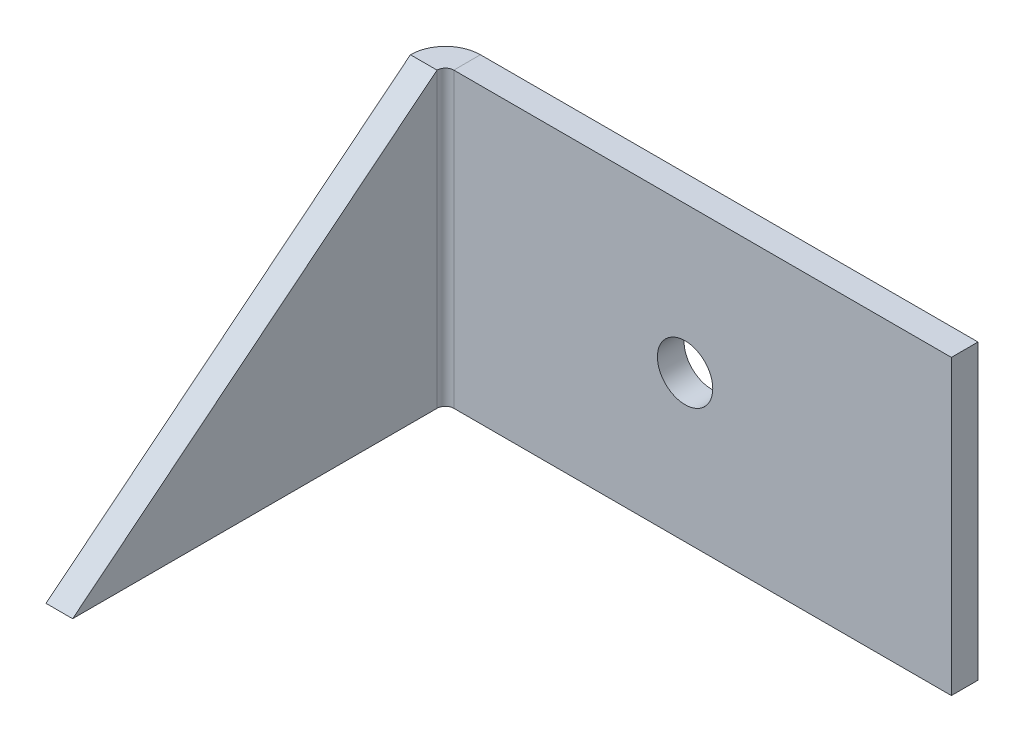
ISO-10303-21;
HEADER;
FILE_DESCRIPTION(('STEP AP214'),'2;1');
FILE_NAME('part.step','',(''),(''),'','','');
FILE_SCHEMA(('AUTOMOTIVE_DESIGN { 1 0 10303 214 1 1 1 1 }'));
ENDSEC;
DATA;
#1=APPLICATION_CONTEXT('core data for automotive mechanical design processes');
#2=APPLICATION_PROTOCOL_DEFINITION('international standard','automotive_design',2000,#1);
#3=PRODUCT_CONTEXT('',#1,'mechanical');
#4=PRODUCT('Part','Part','',(#3));
#5=PRODUCT_RELATED_PRODUCT_CATEGORY('part','',(#4));
#6=PRODUCT_DEFINITION_FORMATION('','',#4);
#7=PRODUCT_DEFINITION_CONTEXT('part definition',#1,'design');
#8=PRODUCT_DEFINITION('design','',#6,#7);
#9=PRODUCT_DEFINITION_SHAPE('','',#8);
#10=(LENGTH_UNIT() NAMED_UNIT(*) SI_UNIT(.MILLI.,.METRE.));
#11=(NAMED_UNIT(*) PLANE_ANGLE_UNIT() SI_UNIT($,.RADIAN.));
#12=(NAMED_UNIT(*) SI_UNIT($,.STERADIAN.) SOLID_ANGLE_UNIT());
#13=UNCERTAINTY_MEASURE_WITH_UNIT(LENGTH_MEASURE(1.E-05),#10,'distance_accuracy_value','');
#14=(GEOMETRIC_REPRESENTATION_CONTEXT(3) GLOBAL_UNCERTAINTY_ASSIGNED_CONTEXT((#13)) GLOBAL_UNIT_ASSIGNED_CONTEXT((#10,
#11,#12)) REPRESENTATION_CONTEXT('',''));
#15=CARTESIAN_POINT('',(0.,0.,0.));
#16=DIRECTION('',(0.,0.,1.));
#17=DIRECTION('',(1.,0.,0.));
#18=AXIS2_PLACEMENT_3D('',#15,#16,#17);
#19=CARTESIAN_POINT('',(-28.575,17.4625,3.175));
#20=DIRECTION('',(0.,-1.,0.));
#21=DIRECTION('',(0.,0.,-1.));
#22=AXIS2_PLACEMENT_3D('',#19,#20,#21);
#23=PLANE('',#22);
#24=DIRECTION('',(0.,0.,-1.));
#25=VECTOR('',#24,1.);
#26=CARTESIAN_POINT('',(-27.575,17.4625,3.175));
#27=LINE('',#26,#25);
#28=CARTESIAN_POINT('',(-27.575,17.4625,3.175));
#29=VERTEX_POINT('',#28);
#30=CARTESIAN_POINT('',(-27.575,17.4625,0.));
#31=VERTEX_POINT('',#30);
#32=EDGE_CURVE('E62',#29,#31,#27,.T.);
#33=ORIENTED_EDGE('',*,*,#32,.F.);
#34=DIRECTION('',(-1.,0.,0.));
#35=VECTOR('',#34,1.);
#36=CARTESIAN_POINT('',(-28.575,17.4625,3.175));
#37=LINE('',#36,#35);
#38=CARTESIAN_POINT('',(31.75,17.4625,3.175));
#39=VERTEX_POINT('',#38);
#40=EDGE_CURVE('E47',#39,#29,#37,.T.);
#41=ORIENTED_EDGE('',*,*,#40,.F.);
#42=DIRECTION('',(0.,0.,1.));
#43=VECTOR('',#42,1.);
#44=CARTESIAN_POINT('',(31.75,17.4625,0.));
#45=LINE('',#44,#43);
#46=CARTESIAN_POINT('',(31.75,17.4625,0.));
#47=VERTEX_POINT('',#46);
#48=EDGE_CURVE('E114',#47,#39,#45,.T.);
#49=ORIENTED_EDGE('',*,*,#48,.F.);
#50=DIRECTION('',(-1.,0.,0.));
#51=VECTOR('',#50,1.);
#52=CARTESIAN_POINT('',(-28.575,17.4625,0.));
#53=LINE('',#52,#51);
#54=EDGE_CURVE('E107',#47,#31,#53,.T.);
#55=ORIENTED_EDGE('',*,*,#54,.T.);
#56=EDGE_LOOP('',(#33,#41,#49,#55));
#57=FACE_BOUND('',#56,.T.);
#58=ADVANCED_FACE('F39',(#57),#23,.F.);
#59=CARTESIAN_POINT('',(-28.575,-17.4625,3.175));
#60=DIRECTION('',(0.,1.,0.));
#61=DIRECTION('',(0.,0.,1.));
#62=AXIS2_PLACEMENT_3D('',#59,#60,#61);
#63=PLANE('',#62);
#64=DIRECTION('',(0.,0.,-1.));
#65=VECTOR('',#64,1.);
#66=CARTESIAN_POINT('',(-27.575,-17.4625,3.175));
#67=LINE('',#66,#65);
#68=CARTESIAN_POINT('',(-27.575,-17.4625,3.175));
#69=VERTEX_POINT('',#68);
#70=CARTESIAN_POINT('',(-27.575,-17.4625,0.));
#71=VERTEX_POINT('',#70);
#72=EDGE_CURVE('E104',#69,#71,#67,.T.);
#73=ORIENTED_EDGE('',*,*,#72,.T.);
#74=DIRECTION('',(1.,0.,0.));
#75=VECTOR('',#74,1.);
#76=CARTESIAN_POINT('',(-28.575,-17.4625,0.));
#77=LINE('',#76,#75);
#78=CARTESIAN_POINT('',(31.75,-17.4625,0.));
#79=VERTEX_POINT('',#78);
#80=EDGE_CURVE('E42',#71,#79,#77,.T.);
#81=ORIENTED_EDGE('',*,*,#80,.T.);
#82=DIRECTION('',(0.,0.,-1.));
#83=VECTOR('',#82,1.);
#84=CARTESIAN_POINT('',(31.75,-17.4625,3.175));
#85=LINE('',#84,#83);
#86=CARTESIAN_POINT('',(31.75,-17.4625,3.175));
#87=VERTEX_POINT('',#86);
#88=EDGE_CURVE('E102',#87,#79,#85,.T.);
#89=ORIENTED_EDGE('',*,*,#88,.F.);
#90=DIRECTION('',(1.,0.,0.));
#91=VECTOR('',#90,1.);
#92=CARTESIAN_POINT('',(-28.575,-17.4625,3.175));
#93=LINE('',#92,#91);
#94=EDGE_CURVE('E11',#69,#87,#93,.T.);
#95=ORIENTED_EDGE('',*,*,#94,.F.);
#96=EDGE_LOOP('',(#73,#81,#89,#95));
#97=FACE_BOUND('',#96,.T.);
#98=ADVANCED_FACE('F100',(#97),#63,.F.);
#99=CARTESIAN_POINT('',(0.,0.,3.175));
#100=DIRECTION('',(0.,0.,1.));
#101=DIRECTION('',(1.,0.,0.));
#102=AXIS2_PLACEMENT_3D('',#99,#100,#101);
#103=PLANE('',#102);
#104=CARTESIAN_POINT('',(0.,0.,3.175));
#105=DIRECTION('',(0.,0.,1.));
#106=DIRECTION('',(1.,0.,0.));
#107=AXIS2_PLACEMENT_3D('',#104,#105,#106);
#108=CIRCLE('',#107,3.29999999999999);
#109=CARTESIAN_POINT('',(3.29999999999999,0.,3.175));
#110=VERTEX_POINT('',#109);
#111=EDGE_CURVE('E162',#110,#110,#108,.T.);
#112=ORIENTED_EDGE('',*,*,#111,.F.);
#113=EDGE_LOOP('',(#112));
#114=FACE_BOUND('',#113,.T.);
#115=ORIENTED_EDGE('',*,*,#40,.T.);
#116=DIRECTION('',(0.,-1.,0.));
#117=VECTOR('',#116,1.);
#118=CARTESIAN_POINT('',(-27.575,-17.4625,3.175));
#119=LINE('',#118,#117);
#120=EDGE_CURVE('E54',#69,#29,#119,.F.);
#121=ORIENTED_EDGE('',*,*,#120,.F.);
#122=ORIENTED_EDGE('',*,*,#94,.T.);
#123=DIRECTION('',(0.,-1.,0.));
#124=VECTOR('',#123,1.);
#125=CARTESIAN_POINT('',(31.75,17.4625,3.175));
#126=LINE('',#125,#124);
#127=EDGE_CURVE('E119',#39,#87,#126,.T.);
#128=ORIENTED_EDGE('',*,*,#127,.F.);
#129=EDGE_LOOP('',(#115,#121,#122,#128));
#130=FACE_BOUND('',#129,.T.);
#131=ADVANCED_FACE('F211',(#114,#130),#103,.T.);
#132=CARTESIAN_POINT('',(0.,0.,0.));
#133=DIRECTION('',(0.,0.,1.));
#134=DIRECTION('',(1.,0.,0.));
#135=AXIS2_PLACEMENT_3D('',#132,#133,#134);
#136=PLANE('',#135);
#137=CARTESIAN_POINT('',(0.,0.,0.));
#138=DIRECTION('',(0.,0.,1.));
#139=DIRECTION('',(1.,0.,0.));
#140=AXIS2_PLACEMENT_3D('',#137,#138,#139);
#141=CIRCLE('',#140,3.3);
#142=CARTESIAN_POINT('',(3.3,0.,0.));
#143=VERTEX_POINT('',#142);
#144=EDGE_CURVE('E166',#143,#143,#141,.T.);
#145=ORIENTED_EDGE('',*,*,#144,.T.);
#146=EDGE_LOOP('',(#145));
#147=FACE_BOUND('',#146,.T.);
#148=DIRECTION('',(0.,-1.,0.));
#149=VECTOR('',#148,1.);
#150=CARTESIAN_POINT('',(-27.575,-17.4625,0.));
#151=LINE('',#150,#149);
#152=EDGE_CURVE('E147',#71,#31,#151,.F.);
#153=ORIENTED_EDGE('',*,*,#152,.T.);
#154=ORIENTED_EDGE('',*,*,#54,.F.);
#155=DIRECTION('',(0.,1.,0.));
#156=VECTOR('',#155,1.);
#157=CARTESIAN_POINT('',(31.75,-17.4625,0.));
#158=LINE('',#157,#156);
#159=EDGE_CURVE('E109',#79,#47,#158,.T.);
#160=ORIENTED_EDGE('',*,*,#159,.F.);
#161=ORIENTED_EDGE('',*,*,#80,.F.);
#162=EDGE_LOOP('',(#153,#154,#160,#161));
#163=FACE_BOUND('',#162,.T.);
#164=ADVANCED_FACE('F110',(#147,#163),#136,.F.);
#165=CARTESIAN_POINT('',(0.,0.,3.175));
#166=DIRECTION('',(0.,0.,1.));
#167=DIRECTION('',(1.,0.,0.));
#168=AXIS2_PLACEMENT_3D('',#165,#166,#167);
#169=CYLINDRICAL_SURFACE('',#168,3.29999999999999);
#170=ORIENTED_EDGE('',*,*,#144,.F.);
#171=EDGE_LOOP('',(#170));
#172=FACE_BOUND('',#171,.T.);
#173=ORIENTED_EDGE('',*,*,#111,.T.);
#174=EDGE_LOOP('',(#173));
#175=FACE_BOUND('',#174,.T.);
#176=ADVANCED_FACE('F204',(#172,#175),#169,.F.);
#177=CARTESIAN_POINT('',(-27.575,17.4625,4.17500000000001));
#178=DIRECTION('',(0.,1.,0.));
#179=DIRECTION('',(0.,0.,1.));
#180=AXIS2_PLACEMENT_3D('',#177,#178,#179);
#181=PLANE('',#180);
#182=DIRECTION('',(-1.,0.,0.));
#183=VECTOR('',#182,1.);
#184=CARTESIAN_POINT('',(-28.575,17.4625,4.175));
#185=LINE('',#184,#183);
#186=CARTESIAN_POINT('',(-28.5750000000001,17.4625,4.175));
#187=VERTEX_POINT('',#186);
#188=CARTESIAN_POINT('',(-31.75,17.4625,4.17499999999999));
#189=VERTEX_POINT('',#188);
#190=EDGE_CURVE('E128',#187,#189,#185,.T.);
#191=ORIENTED_EDGE('',*,*,#190,.F.);
#192=CARTESIAN_POINT('',(-27.575,17.4625,4.17500000000001));
#193=DIRECTION('',(0.,-1.,0.));
#194=DIRECTION('',(0.,0.,-1.));
#195=AXIS2_PLACEMENT_3D('',#192,#193,#194);
#196=CIRCLE('',#195,1.);
#197=EDGE_CURVE('E155',#29,#187,#196,.F.);
#198=ORIENTED_EDGE('',*,*,#197,.F.);
#199=ORIENTED_EDGE('',*,*,#32,.T.);
#200=CARTESIAN_POINT('',(-27.575,17.4625,4.17500000000001));
#201=DIRECTION('',(0.,-1.,0.));
#202=DIRECTION('',(0.,0.,-1.));
#203=AXIS2_PLACEMENT_3D('',#200,#201,#202);
#204=CIRCLE('',#203,4.175);
#205=EDGE_CURVE('E149',#31,#189,#204,.F.);
#206=ORIENTED_EDGE('',*,*,#205,.T.);
#207=EDGE_LOOP('',(#191,#198,#199,#206));
#208=FACE_BOUND('',#207,.T.);
#209=ADVANCED_FACE('F173',(#208),#181,.T.);
#210=CARTESIAN_POINT('',(-27.575,-17.4625,4.17500000000001));
#211=DIRECTION('',(0.,1.,0.));
#212=DIRECTION('',(0.,0.,1.));
#213=AXIS2_PLACEMENT_3D('',#210,#211,#212);
#214=PLANE('',#213);
#215=CARTESIAN_POINT('',(-27.575,-17.4625,4.17500000000001));
#216=DIRECTION('',(0.,-1.,0.));
#217=DIRECTION('',(0.,0.,-1.));
#218=AXIS2_PLACEMENT_3D('',#215,#216,#217);
#219=CIRCLE('',#218,1.);
#220=CARTESIAN_POINT('',(-28.575,-17.4625,4.175));
#221=VERTEX_POINT('',#220);
#222=EDGE_CURVE('E146',#221,#69,#219,.T.);
#223=ORIENTED_EDGE('',*,*,#222,.F.);
#224=DIRECTION('',(-1.,0.,0.));
#225=VECTOR('',#224,1.);
#226=CARTESIAN_POINT('',(-28.575,-17.4625,4.175));
#227=LINE('',#226,#225);
#228=CARTESIAN_POINT('',(-31.75,-17.4625,4.17499999999999));
#229=VERTEX_POINT('',#228);
#230=EDGE_CURVE('E131',#221,#229,#227,.T.);
#231=ORIENTED_EDGE('',*,*,#230,.T.);
#232=CARTESIAN_POINT('',(-27.575,-17.4625,4.17500000000001));
#233=DIRECTION('',(0.,-1.,0.));
#234=DIRECTION('',(0.,0.,-1.));
#235=AXIS2_PLACEMENT_3D('',#232,#233,#234);
#236=CIRCLE('',#235,4.175);
#237=EDGE_CURVE('E150',#229,#71,#236,.T.);
#238=ORIENTED_EDGE('',*,*,#237,.T.);
#239=ORIENTED_EDGE('',*,*,#72,.F.);
#240=EDGE_LOOP('',(#223,#231,#238,#239));
#241=FACE_BOUND('',#240,.T.);
#242=ADVANCED_FACE('F196',(#241),#214,.F.);
#243=CARTESIAN_POINT('',(-27.575,-17.4625,4.17500000000001));
#244=DIRECTION('',(0.,-1.,0.));
#245=DIRECTION('',(-1.,0.,0.));
#246=AXIS2_PLACEMENT_3D('',#243,#244,#245);
#247=CYLINDRICAL_SURFACE('',#246,4.175);
#248=ORIENTED_EDGE('',*,*,#152,.F.);
#249=ORIENTED_EDGE('',*,*,#237,.F.);
#250=DIRECTION('',(0.,1.,0.));
#251=VECTOR('',#250,1.);
#252=CARTESIAN_POINT('',(-31.75,0.,4.17499999999999));
#253=LINE('',#252,#251);
#254=EDGE_CURVE('E134',#229,#189,#253,.T.);
#255=ORIENTED_EDGE('',*,*,#254,.T.);
#256=ORIENTED_EDGE('',*,*,#205,.F.);
#257=EDGE_LOOP('',(#248,#249,#255,#256));
#258=FACE_BOUND('',#257,.T.);
#259=ADVANCED_FACE('F175',(#258),#247,.T.);
#260=CARTESIAN_POINT('',(-27.575,-17.4625,4.17500000000001));
#261=DIRECTION('',(0.,-1.,0.));
#262=DIRECTION('',(-1.,0.,0.));
#263=AXIS2_PLACEMENT_3D('',#260,#261,#262);
#264=CYLINDRICAL_SURFACE('',#263,1.);
#265=ORIENTED_EDGE('',*,*,#120,.T.);
#266=ORIENTED_EDGE('',*,*,#197,.T.);
#267=DIRECTION('',(0.,-1.,0.));
#268=VECTOR('',#267,1.);
#269=CARTESIAN_POINT('',(-28.575,17.4625,4.175));
#270=LINE('',#269,#268);
#271=EDGE_CURVE('E129',#187,#221,#270,.T.);
#272=ORIENTED_EDGE('',*,*,#271,.T.);
#273=ORIENTED_EDGE('',*,*,#222,.T.);
#274=EDGE_LOOP('',(#265,#266,#272,#273));
#275=FACE_BOUND('',#274,.T.);
#276=ADVANCED_FACE('F194',(#275),#264,.F.);
#277=CARTESIAN_POINT('',(-31.7500000000002,-17.4625,47.625));
#278=DIRECTION('',(0.,1.,0.));
#279=DIRECTION('',(-1.,0.,0.));
#280=AXIS2_PLACEMENT_3D('',#277,#278,#279);
#281=PLANE('',#280);
#282=ORIENTED_EDGE('',*,*,#230,.F.);
#283=DIRECTION('',(0.,0.,1.));
#284=VECTOR('',#283,1.);
#285=CARTESIAN_POINT('',(-28.5750000000002,-17.4625,47.625));
#286=LINE('',#285,#284);
#287=CARTESIAN_POINT('',(-28.5750000000001,-17.4625,47.625));
#288=VERTEX_POINT('',#287);
#289=EDGE_CURVE('E138',#221,#288,#286,.T.);
#290=ORIENTED_EDGE('',*,*,#289,.T.);
#291=DIRECTION('',(1.,0.,0.));
#292=VECTOR('',#291,1.);
#293=CARTESIAN_POINT('',(-31.7500000000002,-17.4625,47.625));
#294=LINE('',#293,#292);
#295=CARTESIAN_POINT('',(-31.7500000000002,-17.4625,47.625));
#296=VERTEX_POINT('',#295);
#297=EDGE_CURVE('E142',#296,#288,#294,.T.);
#298=ORIENTED_EDGE('',*,*,#297,.F.);
#299=DIRECTION('',(0.,0.,1.));
#300=VECTOR('',#299,1.);
#301=CARTESIAN_POINT('',(-31.7500000000002,-17.4625,47.625));
#302=LINE('',#301,#300);
#303=EDGE_CURVE('E139',#229,#296,#302,.T.);
#304=ORIENTED_EDGE('',*,*,#303,.F.);
#305=EDGE_LOOP('',(#282,#290,#298,#304));
#306=FACE_BOUND('',#305,.T.);
#307=ADVANCED_FACE('F184',(#306),#281,.F.);
#308=CARTESIAN_POINT('',(-31.75,0.,-1.09221238463229E-13));
#309=DIRECTION('',(1.,0.,0.));
#310=DIRECTION('',(0.,0.,-1.));
#311=AXIS2_PLACEMENT_3D('',#308,#309,#310);
#312=PLANE('',#311);
#313=ORIENTED_EDGE('',*,*,#303,.T.);
#314=DIRECTION('',(0.,-0.626498155753381,0.77942290243334));
#315=VECTOR('',#314,1.);
#316=CARTESIAN_POINT('',(-31.75,12.6471515829947,10.1657484243058));
#317=LINE('',#316,#315);
#318=EDGE_CURVE('E124',#189,#296,#317,.T.);
#319=ORIENTED_EDGE('',*,*,#318,.F.);
#320=ORIENTED_EDGE('',*,*,#254,.F.);
#321=EDGE_LOOP('',(#313,#319,#320));
#322=FACE_BOUND('',#321,.T.);
#323=ADVANCED_FACE('F180',(#322),#312,.F.);
#324=CARTESIAN_POINT('',(-28.575,0.,0.));
#325=DIRECTION('',(1.,0.,0.));
#326=DIRECTION('',(0.,0.,-1.));
#327=AXIS2_PLACEMENT_3D('',#324,#325,#326);
#328=PLANE('',#327);
#329=DIRECTION('',(0.,0.626498155753381,-0.77942290243334));
#330=VECTOR('',#329,1.);
#331=CARTESIAN_POINT('',(-28.575,12.6471515829947,10.1657484243058));
#332=LINE('',#331,#330);
#333=EDGE_CURVE('E126',#288,#187,#332,.T.);
#334=ORIENTED_EDGE('',*,*,#333,.F.);
#335=ORIENTED_EDGE('',*,*,#289,.F.);
#336=ORIENTED_EDGE('',*,*,#271,.F.);
#337=EDGE_LOOP('',(#334,#335,#336));
#338=FACE_BOUND('',#337,.T.);
#339=ADVANCED_FACE('F191',(#338),#328,.T.);
#340=CARTESIAN_POINT('',(28.5750000000001,12.6471515829947,10.165748424306));
#341=DIRECTION('',(0.,-0.77942290243334,-0.626498155753381));
#342=DIRECTION('',(0.,0.626498155753381,-0.77942290243334));
#343=AXIS2_PLACEMENT_3D('',#340,#341,#342);
#344=PLANE('',#343);
#345=ORIENTED_EDGE('',*,*,#333,.T.);
#346=ORIENTED_EDGE('',*,*,#190,.T.);
#347=ORIENTED_EDGE('',*,*,#318,.T.);
#348=ORIENTED_EDGE('',*,*,#297,.T.);
#349=EDGE_LOOP('',(#345,#346,#347,#348));
#350=FACE_BOUND('',#349,.T.);
#351=ADVANCED_FACE('F188',(#350),#344,.F.);
#352=CARTESIAN_POINT('',(31.75,0.,0.));
#353=DIRECTION('',(1.,0.,0.));
#354=DIRECTION('',(0.,1.,0.));
#355=AXIS2_PLACEMENT_3D('',#352,#353,#354);
#356=PLANE('',#355);
#357=ORIENTED_EDGE('',*,*,#88,.T.);
#358=ORIENTED_EDGE('',*,*,#159,.T.);
#359=ORIENTED_EDGE('',*,*,#48,.T.);
#360=ORIENTED_EDGE('',*,*,#127,.T.);
#361=EDGE_LOOP('',(#357,#358,#359,#360));
#362=FACE_BOUND('',#361,.T.);
#363=ADVANCED_FACE('F117',(#362),#356,.T.);
#364=CLOSED_SHELL('',(#58,#98,#131,#164,#176,#209,#242,#259,#276,#307,#323,#339,#351,#363));
#365=MANIFOLD_SOLID_BREP('B2',#364);
#366=ADVANCED_BREP_SHAPE_REPRESENTATION('',(#18,#365),#14);
#367=SHAPE_DEFINITION_REPRESENTATION(#9,#366);
ENDSEC;
END-ISO-10303-21;
